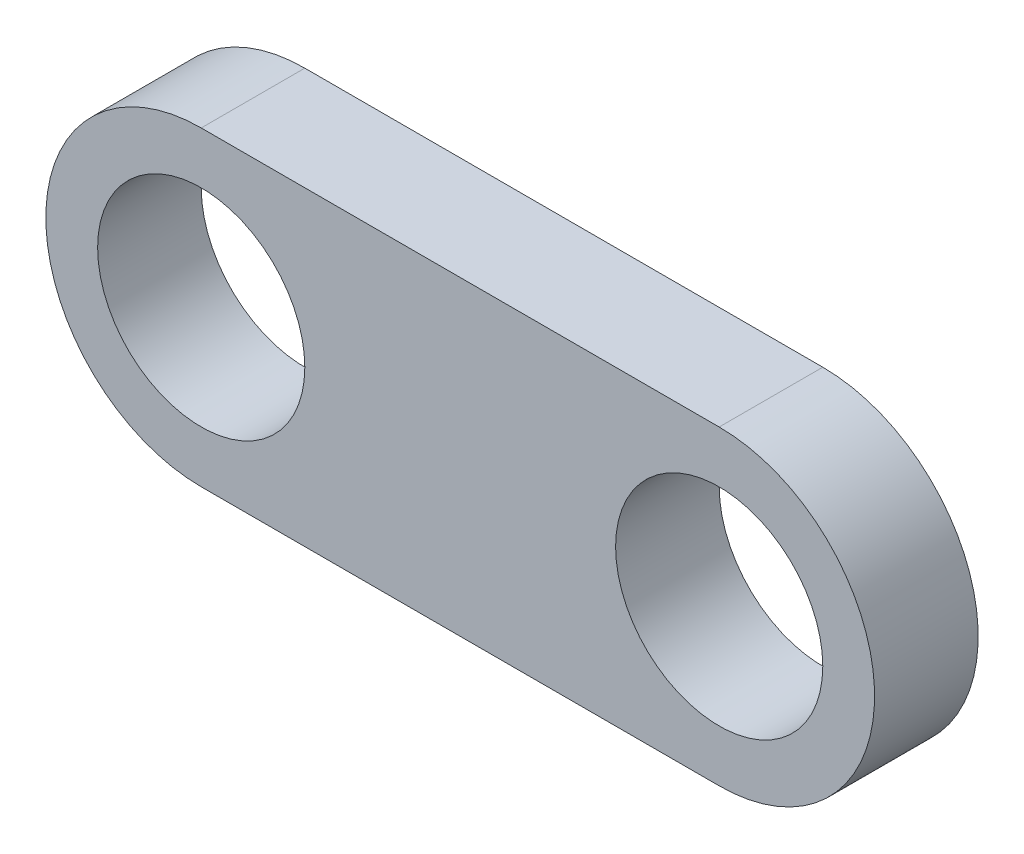
ISO-10303-21;
HEADER;
FILE_DESCRIPTION(('STEP AP214'),'2;1');
FILE_NAME('part.step','',(''),(''),'','','');
FILE_SCHEMA(('AUTOMOTIVE_DESIGN { 1 0 10303 214 1 1 1 1 }'));
ENDSEC;
DATA;
#1=APPLICATION_CONTEXT('core data for automotive mechanical design processes');
#2=APPLICATION_PROTOCOL_DEFINITION('international standard','automotive_design',2000,#1);
#3=PRODUCT_CONTEXT('',#1,'mechanical');
#4=PRODUCT('Part','Part','',(#3));
#5=PRODUCT_RELATED_PRODUCT_CATEGORY('part','',(#4));
#6=PRODUCT_DEFINITION_FORMATION('','',#4);
#7=PRODUCT_DEFINITION_CONTEXT('part definition',#1,'design');
#8=PRODUCT_DEFINITION('design','',#6,#7);
#9=PRODUCT_DEFINITION_SHAPE('','',#8);
#10=(LENGTH_UNIT() NAMED_UNIT(*) SI_UNIT(.MILLI.,.METRE.));
#11=(NAMED_UNIT(*) PLANE_ANGLE_UNIT() SI_UNIT($,.RADIAN.));
#12=(NAMED_UNIT(*) SI_UNIT($,.STERADIAN.) SOLID_ANGLE_UNIT());
#13=UNCERTAINTY_MEASURE_WITH_UNIT(LENGTH_MEASURE(1.E-05),#10,'distance_accuracy_value','');
#14=(GEOMETRIC_REPRESENTATION_CONTEXT(3) GLOBAL_UNCERTAINTY_ASSIGNED_CONTEXT((#13)) GLOBAL_UNIT_ASSIGNED_CONTEXT((#10,
#11,#12)) REPRESENTATION_CONTEXT('',''));
#15=CARTESIAN_POINT('',(0.,0.,0.));
#16=DIRECTION('',(0.,0.,1.));
#17=DIRECTION('',(1.,0.,0.));
#18=AXIS2_PLACEMENT_3D('',#15,#16,#17);
#19=CARTESIAN_POINT('',(0.,0.,10.));
#20=DIRECTION('',(0.,0.,1.));
#21=DIRECTION('',(1.,0.,0.));
#22=AXIS2_PLACEMENT_3D('',#19,#20,#21);
#23=PLANE('',#22);
#24=CARTESIAN_POINT('',(0.,0.,10.));
#25=DIRECTION('',(0.,0.,1.));
#26=DIRECTION('',(1.,0.,0.));
#27=AXIS2_PLACEMENT_3D('',#24,#25,#26);
#28=CIRCLE('',#27,10.);
#29=CARTESIAN_POINT('',(10.,0.,10.));
#30=VERTEX_POINT('',#29);
#31=EDGE_CURVE('E112',#30,#30,#28,.T.);
#32=ORIENTED_EDGE('',*,*,#31,.F.);
#33=EDGE_LOOP('',(#32));
#34=FACE_BOUND('',#33,.T.);
#35=CARTESIAN_POINT('',(0.,0.,10.));
#36=DIRECTION('',(0.,0.,1.));
#37=DIRECTION('',(1.,0.,0.));
#38=AXIS2_PLACEMENT_3D('',#35,#36,#37);
#39=CIRCLE('',#38,15.);
#40=CARTESIAN_POINT('',(0.,15.,10.));
#41=VERTEX_POINT('',#40);
#42=CARTESIAN_POINT('',(0.,-15.,10.));
#43=VERTEX_POINT('',#42);
#44=EDGE_CURVE('E92',#41,#43,#39,.T.);
#45=ORIENTED_EDGE('',*,*,#44,.T.);
#46=DIRECTION('',(1.,0.,0.));
#47=VECTOR('',#46,1.);
#48=CARTESIAN_POINT('',(0.,-15.,10.));
#49=LINE('',#48,#47);
#50=CARTESIAN_POINT('',(50.,-15.,10.));
#51=VERTEX_POINT('',#50);
#52=EDGE_CURVE('E87',#43,#51,#49,.T.);
#53=ORIENTED_EDGE('',*,*,#52,.T.);
#54=CARTESIAN_POINT('',(50.,0.,10.));
#55=DIRECTION('',(0.,0.,1.));
#56=DIRECTION('',(1.,0.,0.));
#57=AXIS2_PLACEMENT_3D('',#54,#55,#56);
#58=CIRCLE('',#57,15.);
#59=CARTESIAN_POINT('',(50.,15.,10.));
#60=VERTEX_POINT('',#59);
#61=EDGE_CURVE('E90',#51,#60,#58,.T.);
#62=ORIENTED_EDGE('',*,*,#61,.T.);
#63=DIRECTION('',(-1.,0.,0.));
#64=VECTOR('',#63,1.);
#65=CARTESIAN_POINT('',(0.,15.,10.));
#66=LINE('',#65,#64);
#67=EDGE_CURVE('E57',#60,#41,#66,.T.);
#68=ORIENTED_EDGE('',*,*,#67,.T.);
#69=EDGE_LOOP('',(#45,#53,#62,#68));
#70=FACE_BOUND('',#69,.T.);
#71=CARTESIAN_POINT('',(50.,0.,10.));
#72=DIRECTION('',(0.,0.,1.));
#73=DIRECTION('',(1.,0.,0.));
#74=AXIS2_PLACEMENT_3D('',#71,#72,#73);
#75=CIRCLE('',#74,10.);
#76=CARTESIAN_POINT('',(60.,0.,10.));
#77=VERTEX_POINT('',#76);
#78=EDGE_CURVE('E134',#77,#77,#75,.T.);
#79=ORIENTED_EDGE('',*,*,#78,.F.);
#80=EDGE_LOOP('',(#79));
#81=FACE_BOUND('',#80,.T.);
#82=ADVANCED_FACE('F39',(#34,#70,#81),#23,.T.);
#83=CARTESIAN_POINT('',(0.,0.,0.));
#84=DIRECTION('',(0.,0.,1.));
#85=DIRECTION('',(1.,0.,0.));
#86=AXIS2_PLACEMENT_3D('',#83,#84,#85);
#87=PLANE('',#86);
#88=CARTESIAN_POINT('',(0.,0.,0.));
#89=DIRECTION('',(0.,0.,1.));
#90=DIRECTION('',(1.,0.,0.));
#91=AXIS2_PLACEMENT_3D('',#88,#89,#90);
#92=CIRCLE('',#91,15.);
#93=CARTESIAN_POINT('',(0.,15.,0.));
#94=VERTEX_POINT('',#93);
#95=CARTESIAN_POINT('',(0.,-15.,0.));
#96=VERTEX_POINT('',#95);
#97=EDGE_CURVE('E108',#94,#96,#92,.T.);
#98=ORIENTED_EDGE('',*,*,#97,.F.);
#99=DIRECTION('',(-1.,0.,0.));
#100=VECTOR('',#99,1.);
#101=CARTESIAN_POINT('',(0.,15.,0.));
#102=LINE('',#101,#100);
#103=CARTESIAN_POINT('',(50.,15.,0.));
#104=VERTEX_POINT('',#103);
#105=EDGE_CURVE('E80',#104,#94,#102,.T.);
#106=ORIENTED_EDGE('',*,*,#105,.F.);
#107=CARTESIAN_POINT('',(50.,0.,0.));
#108=DIRECTION('',(0.,0.,1.));
#109=DIRECTION('',(1.,0.,0.));
#110=AXIS2_PLACEMENT_3D('',#107,#108,#109);
#111=CIRCLE('',#110,15.);
#112=CARTESIAN_POINT('',(50.,-15.,0.));
#113=VERTEX_POINT('',#112);
#114=EDGE_CURVE('E74',#113,#104,#111,.T.);
#115=ORIENTED_EDGE('',*,*,#114,.F.);
#116=DIRECTION('',(1.,0.,0.));
#117=VECTOR('',#116,1.);
#118=CARTESIAN_POINT('',(0.,-15.,0.));
#119=LINE('',#118,#117);
#120=EDGE_CURVE('E97',#96,#113,#119,.T.);
#121=ORIENTED_EDGE('',*,*,#120,.F.);
#122=EDGE_LOOP('',(#98,#106,#115,#121));
#123=FACE_BOUND('',#122,.T.);
#124=CARTESIAN_POINT('',(0.,0.,0.));
#125=DIRECTION('',(0.,0.,1.));
#126=DIRECTION('',(1.,0.,0.));
#127=AXIS2_PLACEMENT_3D('',#124,#125,#126);
#128=CIRCLE('',#127,10.);
#129=CARTESIAN_POINT('',(10.,0.,0.));
#130=VERTEX_POINT('',#129);
#131=EDGE_CURVE('E130',#130,#130,#128,.T.);
#132=ORIENTED_EDGE('',*,*,#131,.T.);
#133=EDGE_LOOP('',(#132));
#134=FACE_BOUND('',#133,.T.);
#135=CARTESIAN_POINT('',(50.,0.,0.));
#136=DIRECTION('',(0.,0.,1.));
#137=DIRECTION('',(1.,0.,0.));
#138=AXIS2_PLACEMENT_3D('',#135,#136,#137);
#139=CIRCLE('',#138,10.);
#140=CARTESIAN_POINT('',(60.,0.,0.));
#141=VERTEX_POINT('',#140);
#142=EDGE_CURVE('E138',#141,#141,#139,.T.);
#143=ORIENTED_EDGE('',*,*,#142,.T.);
#144=EDGE_LOOP('',(#143));
#145=FACE_BOUND('',#144,.T.);
#146=ADVANCED_FACE('F125',(#123,#134,#145),#87,.F.);
#147=CARTESIAN_POINT('',(0.,0.,10.));
#148=DIRECTION('',(0.,0.,-1.));
#149=DIRECTION('',(-1.,0.,0.));
#150=AXIS2_PLACEMENT_3D('',#147,#148,#149);
#151=CYLINDRICAL_SURFACE('',#150,15.);
#152=ORIENTED_EDGE('',*,*,#97,.T.);
#153=DIRECTION('',(0.,0.,-1.));
#154=VECTOR('',#153,1.);
#155=CARTESIAN_POINT('',(0.,-15.,10.));
#156=LINE('',#155,#154);
#157=EDGE_CURVE('E11',#43,#96,#156,.T.);
#158=ORIENTED_EDGE('',*,*,#157,.F.);
#159=ORIENTED_EDGE('',*,*,#44,.F.);
#160=DIRECTION('',(0.,0.,-1.));
#161=VECTOR('',#160,1.);
#162=CARTESIAN_POINT('',(0.,15.,10.));
#163=LINE('',#162,#161);
#164=EDGE_CURVE('E104',#41,#94,#163,.T.);
#165=ORIENTED_EDGE('',*,*,#164,.T.);
#166=EDGE_LOOP('',(#152,#158,#159,#165));
#167=FACE_BOUND('',#166,.T.);
#168=ADVANCED_FACE('F41',(#167),#151,.T.);
#169=CARTESIAN_POINT('',(0.,-15.,10.));
#170=DIRECTION('',(0.,1.,0.));
#171=DIRECTION('',(0.,0.,1.));
#172=AXIS2_PLACEMENT_3D('',#169,#170,#171);
#173=PLANE('',#172);
#174=ORIENTED_EDGE('',*,*,#120,.T.);
#175=DIRECTION('',(0.,0.,-1.));
#176=VECTOR('',#175,1.);
#177=CARTESIAN_POINT('',(50.,-15.,10.));
#178=LINE('',#177,#176);
#179=EDGE_CURVE('E49',#51,#113,#178,.T.);
#180=ORIENTED_EDGE('',*,*,#179,.F.);
#181=ORIENTED_EDGE('',*,*,#52,.F.);
#182=ORIENTED_EDGE('',*,*,#157,.T.);
#183=EDGE_LOOP('',(#174,#180,#181,#182));
#184=FACE_BOUND('',#183,.T.);
#185=ADVANCED_FACE('F96',(#184),#173,.F.);
#186=CARTESIAN_POINT('',(50.,0.,10.));
#187=DIRECTION('',(0.,0.,-1.));
#188=DIRECTION('',(-1.,0.,0.));
#189=AXIS2_PLACEMENT_3D('',#186,#187,#188);
#190=CYLINDRICAL_SURFACE('',#189,15.);
#191=ORIENTED_EDGE('',*,*,#114,.T.);
#192=DIRECTION('',(0.,0.,-1.));
#193=VECTOR('',#192,1.);
#194=CARTESIAN_POINT('',(50.,15.,10.));
#195=LINE('',#194,#193);
#196=EDGE_CURVE('E99',#60,#104,#195,.T.);
#197=ORIENTED_EDGE('',*,*,#196,.F.);
#198=ORIENTED_EDGE('',*,*,#61,.F.);
#199=ORIENTED_EDGE('',*,*,#179,.T.);
#200=EDGE_LOOP('',(#191,#197,#198,#199));
#201=FACE_BOUND('',#200,.T.);
#202=ADVANCED_FACE('F100',(#201),#190,.T.);
#203=CARTESIAN_POINT('',(0.,15.,10.));
#204=DIRECTION('',(0.,-1.,0.));
#205=DIRECTION('',(0.,0.,-1.));
#206=AXIS2_PLACEMENT_3D('',#203,#204,#205);
#207=PLANE('',#206);
#208=ORIENTED_EDGE('',*,*,#105,.T.);
#209=ORIENTED_EDGE('',*,*,#164,.F.);
#210=ORIENTED_EDGE('',*,*,#67,.F.);
#211=ORIENTED_EDGE('',*,*,#196,.T.);
#212=EDGE_LOOP('',(#208,#209,#210,#211));
#213=FACE_BOUND('',#212,.T.);
#214=ADVANCED_FACE('F122',(#213),#207,.F.);
#215=CARTESIAN_POINT('',(0.,0.,10.));
#216=DIRECTION('',(0.,0.,-1.));
#217=DIRECTION('',(-1.,0.,0.));
#218=AXIS2_PLACEMENT_3D('',#215,#216,#217);
#219=CYLINDRICAL_SURFACE('',#218,10.);
#220=ORIENTED_EDGE('',*,*,#31,.T.);
#221=EDGE_LOOP('',(#220));
#222=FACE_BOUND('',#221,.T.);
#223=ORIENTED_EDGE('',*,*,#131,.F.);
#224=EDGE_LOOP('',(#223));
#225=FACE_BOUND('',#224,.T.);
#226=ADVANCED_FACE('F157',(#222,#225),#219,.F.);
#227=CARTESIAN_POINT('',(50.,0.,10.));
#228=DIRECTION('',(0.,0.,-1.));
#229=DIRECTION('',(-1.,0.,0.));
#230=AXIS2_PLACEMENT_3D('',#227,#228,#229);
#231=CYLINDRICAL_SURFACE('',#230,10.);
#232=ORIENTED_EDGE('',*,*,#78,.T.);
#233=EDGE_LOOP('',(#232));
#234=FACE_BOUND('',#233,.T.);
#235=ORIENTED_EDGE('',*,*,#142,.F.);
#236=EDGE_LOOP('',(#235));
#237=FACE_BOUND('',#236,.T.);
#238=ADVANCED_FACE('F146',(#234,#237),#231,.F.);
#239=CLOSED_SHELL('',(#82,#146,#168,#185,#202,#214,#226,#238));
#240=MANIFOLD_SOLID_BREP('B2',#239);
#241=ADVANCED_BREP_SHAPE_REPRESENTATION('',(#18,#240),#14);
#242=SHAPE_DEFINITION_REPRESENTATION(#9,#241);
ENDSEC;
END-ISO-10303-21;
